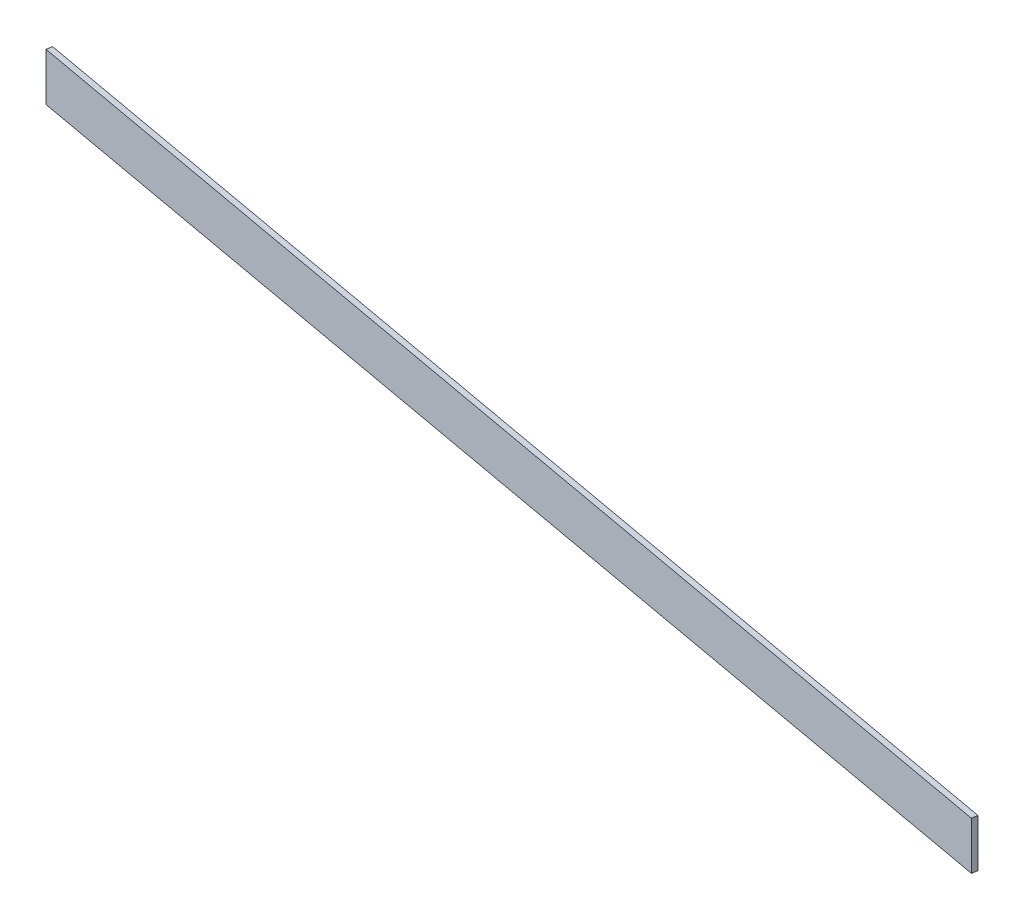
ISO-10303-21;
HEADER;
FILE_DESCRIPTION(('STEP AP214'),'2;1');
FILE_NAME('part.step','',(''),(''),'','','');
FILE_SCHEMA(('AUTOMOTIVE_DESIGN { 1 0 10303 214 1 1 1 1 }'));
ENDSEC;
DATA;
#1=APPLICATION_CONTEXT('core data for automotive mechanical design processes');
#2=APPLICATION_PROTOCOL_DEFINITION('international standard','automotive_design',2000,#1);
#3=PRODUCT_CONTEXT('',#1,'mechanical');
#4=PRODUCT('Part','Part','',(#3));
#5=PRODUCT_RELATED_PRODUCT_CATEGORY('part','',(#4));
#6=PRODUCT_DEFINITION_FORMATION('','',#4);
#7=PRODUCT_DEFINITION_CONTEXT('part definition',#1,'design');
#8=PRODUCT_DEFINITION('design','',#6,#7);
#9=PRODUCT_DEFINITION_SHAPE('','',#8);
#10=(LENGTH_UNIT() NAMED_UNIT(*) SI_UNIT(.MILLI.,.METRE.));
#11=(NAMED_UNIT(*) PLANE_ANGLE_UNIT() SI_UNIT($,.RADIAN.));
#12=(NAMED_UNIT(*) SI_UNIT($,.STERADIAN.) SOLID_ANGLE_UNIT());
#13=UNCERTAINTY_MEASURE_WITH_UNIT(LENGTH_MEASURE(1.E-05),#10,'distance_accuracy_value','');
#14=(GEOMETRIC_REPRESENTATION_CONTEXT(3) GLOBAL_UNCERTAINTY_ASSIGNED_CONTEXT((#13)) GLOBAL_UNIT_ASSIGNED_CONTEXT((#10,
#11,#12)) REPRESENTATION_CONTEXT('',''));
#15=CARTESIAN_POINT('',(0.,0.,0.));
#16=DIRECTION('',(0.,0.,1.));
#17=DIRECTION('',(1.,0.,0.));
#18=AXIS2_PLACEMENT_3D('',#15,#16,#17);
#19=CARTESIAN_POINT('',(-35.4393189557898,-2540.,1767.16289518098));
#20=DIRECTION('',(-0.177172313667308,0.,0.984179847014647));
#21=DIRECTION('',(0.984179847014647,0.,0.177172313667308));
#22=AXIS2_PLACEMENT_3D('',#19,#20,#21);
#23=PLANE('',#22);
#24=DIRECTION('',(0.,1.,0.));
#25=VECTOR('',#24,1.);
#26=CARTESIAN_POINT('',(-410.411840668454,-2222.69302453191,1699.66024367373));
#27=LINE('',#26,#25);
#28=CARTESIAN_POINT('',(-410.411840668454,-2241.55,1699.66024367373));
#29=VERTEX_POINT('',#28);
#30=CARTESIAN_POINT('',(-410.411840668453,-2209.8,1699.66024367373));
#31=VERTEX_POINT('',#30);
#32=EDGE_CURVE('E58',#29,#31,#27,.T.);
#33=ORIENTED_EDGE('',*,*,#32,.F.);
#34=DIRECTION('',(-0.984179847014643,0.,-0.177172313667329));
#35=VECTOR('',#34,1.);
#36=CARTESIAN_POINT('',(339.533202756722,-2241.55,1834.66554668824));
#37=LINE('',#36,#35);
#38=CARTESIAN_POINT('',(339.533202756723,-2241.55,1834.66554668823));
#39=VERTEX_POINT('',#38);
#40=EDGE_CURVE('E20',#39,#29,#37,.T.);
#41=ORIENTED_EDGE('',*,*,#40,.F.);
#42=DIRECTION('',(0.,1.,0.));
#43=VECTOR('',#42,1.);
#44=CARTESIAN_POINT('',(339.533202756722,-2222.74641459709,1834.66554668824));
#45=LINE('',#44,#43);
#46=CARTESIAN_POINT('',(339.533202756723,-2209.8,1834.66554668823));
#47=VERTEX_POINT('',#46);
#48=EDGE_CURVE('E55',#39,#47,#45,.T.);
#49=ORIENTED_EDGE('',*,*,#48,.T.);
#50=DIRECTION('',(-0.984179847014643,0.,-0.177172313667329));
#51=VECTOR('',#50,1.);
#52=CARTESIAN_POINT('',(339.533202756722,-2209.8,1834.66554668824));
#53=LINE('',#52,#51);
#54=EDGE_CURVE('E76',#47,#31,#53,.T.);
#55=ORIENTED_EDGE('',*,*,#54,.T.);
#56=EDGE_LOOP('',(#33,#41,#49,#55));
#57=FACE_BOUND('',#56,.T.);
#58=ADVANCED_FACE('F17',(#57),#23,.T.);
#59=CARTESIAN_POINT('',(-35.4393189557898,-2241.55,1767.16289518098));
#60=DIRECTION('',(0.,-1.,0.));
#61=DIRECTION('',(0.,0.,-1.));
#62=AXIS2_PLACEMENT_3D('',#59,#60,#61);
#63=PLANE('',#62);
#64=DIRECTION('',(-0.177172313667308,0.,0.984179847014647));
#65=VECTOR('',#64,1.);
#66=CARTESIAN_POINT('',(-410.411840668454,-2241.55,1699.66024367373));
#67=LINE('',#66,#65);
#68=CARTESIAN_POINT('',(-409.736814153386,-2241.55,1695.91051845666));
#69=VERTEX_POINT('',#68);
#70=EDGE_CURVE('E78',#69,#29,#67,.T.);
#71=ORIENTED_EDGE('',*,*,#70,.F.);
#72=DIRECTION('',(0.984179847014647,0.,0.177172313667308));
#73=VECTOR('',#72,1.);
#74=CARTESIAN_POINT('',(-34.7642924407198,-2241.55,1763.41316996391));
#75=LINE('',#74,#73);
#76=CARTESIAN_POINT('',(340.208229271791,-2241.55,1830.91582147116));
#77=VERTEX_POINT('',#76);
#78=EDGE_CURVE('E73',#69,#77,#75,.T.);
#79=ORIENTED_EDGE('',*,*,#78,.T.);
#80=DIRECTION('',(-0.177172313667308,0.,0.984179847014647));
#81=VECTOR('',#80,1.);
#82=CARTESIAN_POINT('',(339.533202756722,-2241.55,1834.66554668824));
#83=LINE('',#82,#81);
#84=EDGE_CURVE('E63',#77,#39,#83,.T.);
#85=ORIENTED_EDGE('',*,*,#84,.T.);
#86=ORIENTED_EDGE('',*,*,#40,.T.);
#87=EDGE_LOOP('',(#71,#79,#85,#86));
#88=FACE_BOUND('',#87,.T.);
#89=ADVANCED_FACE('F72',(#88),#63,.T.);
#90=CARTESIAN_POINT('',(339.533202756722,-2222.74641459709,1834.66554668824));
#91=DIRECTION('',(-0.984179847014647,0.,-0.177172313667308));
#92=DIRECTION('',(-0.177172313667308,0.,0.984179847014647));
#93=AXIS2_PLACEMENT_3D('',#90,#91,#92);
#94=PLANE('',#93);
#95=ORIENTED_EDGE('',*,*,#48,.F.);
#96=ORIENTED_EDGE('',*,*,#84,.F.);
#97=DIRECTION('',(0.,1.,0.));
#98=VECTOR('',#97,1.);
#99=CARTESIAN_POINT('',(340.208229271796,-2540.,1830.91582147115));
#100=LINE('',#99,#98);
#101=CARTESIAN_POINT('',(340.208229271789,-2209.8,1830.91582147116));
#102=VERTEX_POINT('',#101);
#103=EDGE_CURVE('E83',#77,#102,#100,.T.);
#104=ORIENTED_EDGE('',*,*,#103,.T.);
#105=DIRECTION('',(-0.177172313669245,0.,0.984179847014298));
#106=VECTOR('',#105,1.);
#107=CARTESIAN_POINT('',(340.208229271792,-2209.8,1830.91582147117));
#108=LINE('',#107,#106);
#109=EDGE_CURVE('E69',#102,#47,#108,.T.);
#110=ORIENTED_EDGE('',*,*,#109,.T.);
#111=EDGE_LOOP('',(#95,#96,#104,#110));
#112=FACE_BOUND('',#111,.T.);
#113=ADVANCED_FACE('F66',(#112),#94,.F.);
#114=CARTESIAN_POINT('',(-35.4393189557898,-2209.8,1767.16289518098));
#115=DIRECTION('',(0.,-1.,0.));
#116=DIRECTION('',(0.,0.,-1.));
#117=AXIS2_PLACEMENT_3D('',#114,#115,#116);
#118=PLANE('',#117);
#119=ORIENTED_EDGE('',*,*,#54,.F.);
#120=ORIENTED_EDGE('',*,*,#109,.F.);
#121=DIRECTION('',(0.984179847014647,0.,0.177172313667308));
#122=VECTOR('',#121,1.);
#123=CARTESIAN_POINT('',(-34.7642924407198,-2209.8,1763.41316996391));
#124=LINE('',#123,#122);
#125=CARTESIAN_POINT('',(-409.736814153386,-2209.8,1695.91051845666));
#126=VERTEX_POINT('',#125);
#127=EDGE_CURVE('E26',#102,#126,#124,.F.);
#128=ORIENTED_EDGE('',*,*,#127,.T.);
#129=DIRECTION('',(-0.177172313667308,0.,0.984179847014647));
#130=VECTOR('',#129,1.);
#131=CARTESIAN_POINT('',(-410.411840668454,-2209.8,1699.66024367373));
#132=LINE('',#131,#130);
#133=EDGE_CURVE('E34',#31,#126,#132,.F.);
#134=ORIENTED_EDGE('',*,*,#133,.F.);
#135=EDGE_LOOP('',(#119,#120,#128,#134));
#136=FACE_BOUND('',#135,.T.);
#137=ADVANCED_FACE('F88',(#136),#118,.F.);
#138=CARTESIAN_POINT('',(-410.411840668454,-2222.69302453191,1699.66024367373));
#139=DIRECTION('',(-0.984179847014647,0.,-0.177172313667308));
#140=DIRECTION('',(-0.177172313667308,0.,0.984179847014647));
#141=AXIS2_PLACEMENT_3D('',#138,#139,#140);
#142=PLANE('',#141);
#143=ORIENTED_EDGE('',*,*,#133,.T.);
#144=DIRECTION('',(0.,1.,0.));
#145=VECTOR('',#144,1.);
#146=CARTESIAN_POINT('',(-409.736814153383,-2540.,1695.91051845665));
#147=LINE('',#146,#145);
#148=EDGE_CURVE('E11',#126,#69,#147,.F.);
#149=ORIENTED_EDGE('',*,*,#148,.T.);
#150=ORIENTED_EDGE('',*,*,#70,.T.);
#151=ORIENTED_EDGE('',*,*,#32,.T.);
#152=EDGE_LOOP('',(#143,#149,#150,#151));
#153=FACE_BOUND('',#152,.T.);
#154=ADVANCED_FACE('F91',(#153),#142,.T.);
#155=CARTESIAN_POINT('',(-34.7642924407198,-2540.,1763.41316996391));
#156=DIRECTION('',(-0.177172313667308,0.,0.984179847014647));
#157=DIRECTION('',(0.984179847014647,0.,0.177172313667308));
#158=AXIS2_PLACEMENT_3D('',#155,#156,#157);
#159=PLANE('',#158);
#160=ORIENTED_EDGE('',*,*,#127,.F.);
#161=ORIENTED_EDGE('',*,*,#103,.F.);
#162=ORIENTED_EDGE('',*,*,#78,.F.);
#163=ORIENTED_EDGE('',*,*,#148,.F.);
#164=EDGE_LOOP('',(#160,#161,#162,#163));
#165=FACE_BOUND('',#164,.T.);
#166=ADVANCED_FACE('F90',(#165),#159,.F.);
#167=CLOSED_SHELL('',(#58,#89,#113,#137,#154,#166));
#168=MANIFOLD_SOLID_BREP('B1',#167);
#169=ADVANCED_BREP_SHAPE_REPRESENTATION('',(#18,#168),#14);
#170=SHAPE_DEFINITION_REPRESENTATION(#9,#169);
ENDSEC;
END-ISO-10303-21;
